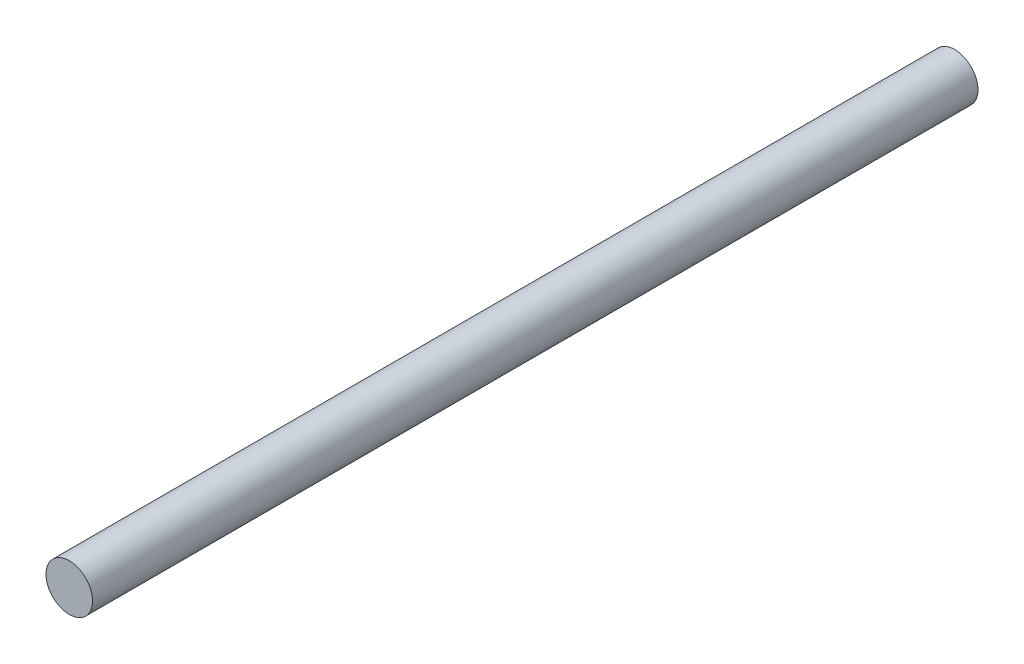
ISO-10303-21;
HEADER;
FILE_DESCRIPTION(('STEP AP214'),'2;1');
FILE_NAME('part.step','',(''),(''),'','','');
FILE_SCHEMA(('AUTOMOTIVE_DESIGN { 1 0 10303 214 1 1 1 1 }'));
ENDSEC;
DATA;
#1=APPLICATION_CONTEXT('core data for automotive mechanical design processes');
#2=APPLICATION_PROTOCOL_DEFINITION('international standard','automotive_design',2000,#1);
#3=PRODUCT_CONTEXT('',#1,'mechanical');
#4=PRODUCT('Part','Part','',(#3));
#5=PRODUCT_RELATED_PRODUCT_CATEGORY('part','',(#4));
#6=PRODUCT_DEFINITION_FORMATION('','',#4);
#7=PRODUCT_DEFINITION_CONTEXT('part definition',#1,'design');
#8=PRODUCT_DEFINITION('design','',#6,#7);
#9=PRODUCT_DEFINITION_SHAPE('','',#8);
#10=(LENGTH_UNIT() NAMED_UNIT(*) SI_UNIT(.MILLI.,.METRE.));
#11=(NAMED_UNIT(*) PLANE_ANGLE_UNIT() SI_UNIT($,.RADIAN.));
#12=(NAMED_UNIT(*) SI_UNIT($,.STERADIAN.) SOLID_ANGLE_UNIT());
#13=UNCERTAINTY_MEASURE_WITH_UNIT(LENGTH_MEASURE(1.E-05),#10,'distance_accuracy_value','');
#14=(GEOMETRIC_REPRESENTATION_CONTEXT(3) GLOBAL_UNCERTAINTY_ASSIGNED_CONTEXT((#13)) GLOBAL_UNIT_ASSIGNED_CONTEXT((#10,
#11,#12)) REPRESENTATION_CONTEXT('',''));
#15=CARTESIAN_POINT('',(0.,0.,0.));
#16=DIRECTION('',(0.,0.,1.));
#17=DIRECTION('',(1.,0.,0.));
#18=AXIS2_PLACEMENT_3D('',#15,#16,#17);
#19=CARTESIAN_POINT('',(0.,0.,76.));
#20=DIRECTION('',(0.,0.,-1.));
#21=DIRECTION('',(-1.,0.,0.));
#22=AXIS2_PLACEMENT_3D('',#19,#20,#21);
#23=CYLINDRICAL_SURFACE('',#22,2.);
#24=CARTESIAN_POINT('',(0.,0.,76.));
#25=DIRECTION('',(0.,0.,1.));
#26=DIRECTION('',(1.,0.,0.));
#27=AXIS2_PLACEMENT_3D('',#24,#25,#26);
#28=CIRCLE('',#27,2.);
#29=CARTESIAN_POINT('',(2.,0.,76.));
#30=VERTEX_POINT('',#29);
#31=EDGE_CURVE('E10',#30,#30,#28,.T.);
#32=ORIENTED_EDGE('',*,*,#31,.F.);
#33=EDGE_LOOP('',(#32));
#34=FACE_BOUND('',#33,.T.);
#35=CARTESIAN_POINT('',(0.,0.,0.));
#36=DIRECTION('',(0.,0.,1.));
#37=DIRECTION('',(1.,0.,0.));
#38=AXIS2_PLACEMENT_3D('',#35,#36,#37);
#39=CIRCLE('',#38,2.);
#40=CARTESIAN_POINT('',(2.,0.,0.));
#41=VERTEX_POINT('',#40);
#42=EDGE_CURVE('E34',#41,#41,#39,.T.);
#43=ORIENTED_EDGE('',*,*,#42,.T.);
#44=EDGE_LOOP('',(#43));
#45=FACE_BOUND('',#44,.T.);
#46=ADVANCED_FACE('F31',(#34,#45),#23,.T.);
#47=CARTESIAN_POINT('',(0.,0.,76.));
#48=DIRECTION('',(0.,0.,1.));
#49=DIRECTION('',(1.,0.,0.));
#50=AXIS2_PLACEMENT_3D('',#47,#48,#49);
#51=PLANE('',#50);
#52=ORIENTED_EDGE('',*,*,#31,.T.);
#53=EDGE_LOOP('',(#52));
#54=FACE_BOUND('',#53,.T.);
#55=ADVANCED_FACE('F46',(#54),#51,.T.);
#56=CARTESIAN_POINT('',(0.,0.,0.));
#57=DIRECTION('',(0.,0.,1.));
#58=DIRECTION('',(1.,0.,0.));
#59=AXIS2_PLACEMENT_3D('',#56,#57,#58);
#60=PLANE('',#59);
#61=ORIENTED_EDGE('',*,*,#42,.F.);
#62=EDGE_LOOP('',(#61));
#63=FACE_BOUND('',#62,.T.);
#64=ADVANCED_FACE('F44',(#63),#60,.F.);
#65=CLOSED_SHELL('',(#46,#55,#64));
#66=MANIFOLD_SOLID_BREP('B2',#65);
#67=ADVANCED_BREP_SHAPE_REPRESENTATION('',(#18,#66),#14);
#68=SHAPE_DEFINITION_REPRESENTATION(#9,#67);
ENDSEC;
END-ISO-10303-21;
